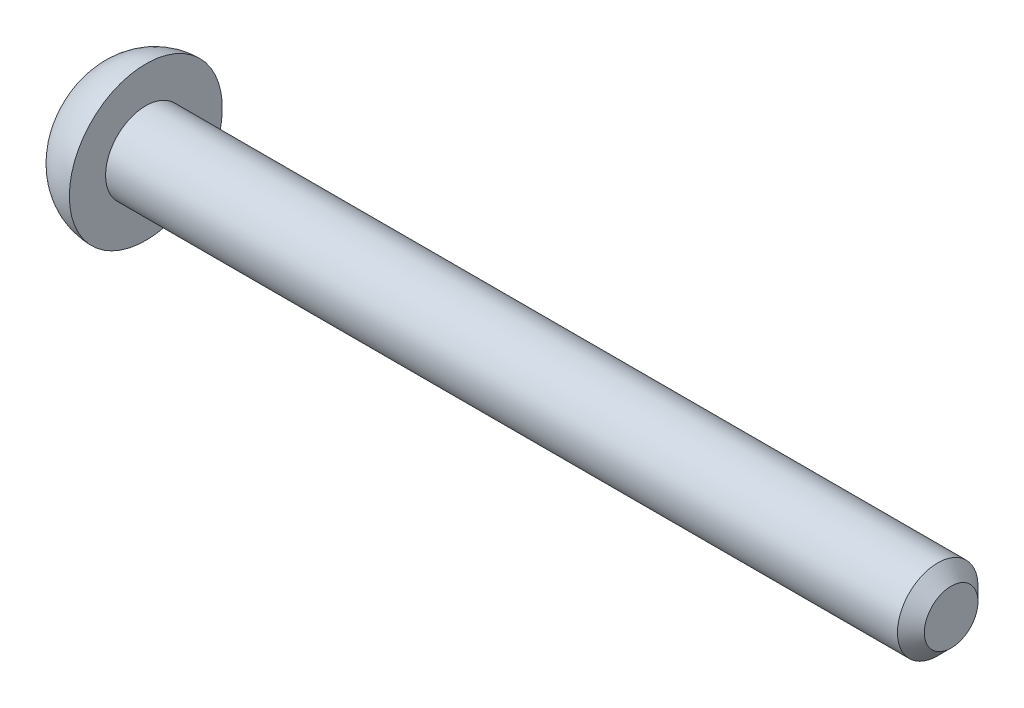
ISO-10303-21;
HEADER;
FILE_DESCRIPTION(('STEP AP214'),'2;1');
FILE_NAME('part.step','',(''),(''),'','','');
FILE_SCHEMA(('AUTOMOTIVE_DESIGN { 1 0 10303 214 1 1 1 1 }'));
ENDSEC;
DATA;
#1=APPLICATION_CONTEXT('core data for automotive mechanical design processes');
#2=APPLICATION_PROTOCOL_DEFINITION('international standard','automotive_design',2000,#1);
#3=PRODUCT_CONTEXT('',#1,'mechanical');
#4=PRODUCT('Part','Part','',(#3));
#5=PRODUCT_RELATED_PRODUCT_CATEGORY('part','',(#4));
#6=PRODUCT_DEFINITION_FORMATION('','',#4);
#7=PRODUCT_DEFINITION_CONTEXT('part definition',#1,'design');
#8=PRODUCT_DEFINITION('design','',#6,#7);
#9=PRODUCT_DEFINITION_SHAPE('','',#8);
#10=(LENGTH_UNIT() NAMED_UNIT(*) SI_UNIT(.MILLI.,.METRE.));
#11=(NAMED_UNIT(*) PLANE_ANGLE_UNIT() SI_UNIT($,.RADIAN.));
#12=(NAMED_UNIT(*) SI_UNIT($,.STERADIAN.) SOLID_ANGLE_UNIT());
#13=UNCERTAINTY_MEASURE_WITH_UNIT(LENGTH_MEASURE(1.E-05),#10,'distance_accuracy_value','');
#14=(GEOMETRIC_REPRESENTATION_CONTEXT(3) GLOBAL_UNCERTAINTY_ASSIGNED_CONTEXT((#13)) GLOBAL_UNIT_ASSIGNED_CONTEXT((#10,
#11,#12)) REPRESENTATION_CONTEXT('',''));
#15=CARTESIAN_POINT('',(0.,0.,0.));
#16=DIRECTION('',(0.,0.,1.));
#17=DIRECTION('',(1.,0.,0.));
#18=AXIS2_PLACEMENT_3D('',#15,#16,#17);
#19=CARTESIAN_POINT('',(-31.65,0.,-2.04903810567666));
#20=DIRECTION('',(1.,0.,0.));
#21=DIRECTION('',(0.,0.,-1.));
#22=AXIS2_PLACEMENT_3D('',#19,#20,#21);
#23=PLANE('',#22);
#24=CARTESIAN_POINT('',(-31.65,0.,0.));
#25=DIRECTION('',(-1.,0.,0.));
#26=DIRECTION('',(0.,0.,1.));
#27=AXIS2_PLACEMENT_3D('',#24,#25,#26);
#28=CIRCLE('',#27,2.04903810567666);
#29=CARTESIAN_POINT('',(-31.65,0.,2.04903810567666));
#30=VERTEX_POINT('',#29);
#31=EDGE_CURVE('E214',#30,#30,#28,.T.);
#32=ORIENTED_EDGE('',*,*,#31,.T.);
#33=EDGE_LOOP('',(#32));
#34=FACE_BOUND('',#33,.T.);
#35=CARTESIAN_POINT('',(-31.65,2.04903810567666,0.));
#36=DIRECTION('',(1.,0.,0.));
#37=DIRECTION('',(0.,0.,1.));
#38=AXIS2_PLACEMENT_3D('',#35,#36,#37);
#39=CIRCLE('',#38,1.02907378905691);
#40=CARTESIAN_POINT('',(-31.65,1.20759961003623,0.592430689092257));
#41=VERTEX_POINT('',#40);
#42=CARTESIAN_POINT('',(-31.65,1.20759961003623,-0.592430689092258));
#43=VERTEX_POINT('',#42);
#44=EDGE_CURVE('E160',#41,#43,#39,.T.);
#45=ORIENTED_EDGE('',*,*,#44,.F.);
#46=CARTESIAN_POINT('',(-31.65,1.12583302491977,0.650000000000001));
#47=DIRECTION('',(-1.,0.,0.));
#48=DIRECTION('',(0.,0.,1.));
#49=AXIS2_PLACEMENT_3D('',#46,#47,#48);
#50=CIRCLE('',#49,0.1);
#51=CARTESIAN_POINT('',(-31.65,1.11685983175353,0.74959659534543));
#52=VERTEX_POINT('',#51);
#53=EDGE_CURVE('E50',#52,#41,#50,.T.);
#54=ORIENTED_EDGE('',*,*,#53,.F.);
#55=CARTESIAN_POINT('',(-31.65,1.02451905283833,1.77451905283833));
#56=DIRECTION('',(1.,0.,0.));
#57=DIRECTION('',(0.,0.,1.));
#58=AXIS2_PLACEMENT_3D('',#55,#56,#57);
#59=CIRCLE('',#58,1.02907378905691);
#60=CARTESIAN_POINT('',(-31.65,0.0907397782827011,1.34202728443769));
#61=VERTEX_POINT('',#60);
#62=EDGE_CURVE('E187',#61,#52,#59,.T.);
#63=ORIENTED_EDGE('',*,*,#62,.F.);
#64=CARTESIAN_POINT('',(-31.65,0.,1.3));
#65=DIRECTION('',(-1.,0.,0.));
#66=DIRECTION('',(0.,0.,1.));
#67=AXIS2_PLACEMENT_3D('',#64,#65,#66);
#68=CIRCLE('',#67,0.1);
#69=CARTESIAN_POINT('',(-31.65,-0.0907397782827009,1.34202728443769));
#70=VERTEX_POINT('',#69);
#71=EDGE_CURVE('E185',#70,#61,#68,.T.);
#72=ORIENTED_EDGE('',*,*,#71,.F.);
#73=CARTESIAN_POINT('',(-31.65,-1.02451905283833,1.77451905283833));
#74=DIRECTION('',(1.,0.,0.));
#75=DIRECTION('',(0.,0.,1.));
#76=AXIS2_PLACEMENT_3D('',#73,#74,#75);
#77=CIRCLE('',#76,1.02907378905691);
#78=CARTESIAN_POINT('',(-31.65,-1.11685983175353,0.74959659534543));
#79=VERTEX_POINT('',#78);
#80=EDGE_CURVE('E134',#79,#70,#77,.T.);
#81=ORIENTED_EDGE('',*,*,#80,.F.);
#82=CARTESIAN_POINT('',(-31.65,-1.12583302491977,0.650000000000001));
#83=DIRECTION('',(-1.,0.,0.));
#84=DIRECTION('',(0.,0.,-1.));
#85=AXIS2_PLACEMENT_3D('',#82,#83,#84);
#86=CIRCLE('',#85,0.0999999999999997);
#87=CARTESIAN_POINT('',(-31.65,-1.20759961003623,0.592430689092258));
#88=VERTEX_POINT('',#87);
#89=EDGE_CURVE('E181',#88,#79,#86,.T.);
#90=ORIENTED_EDGE('',*,*,#89,.F.);
#91=CARTESIAN_POINT('',(-31.65,-2.04903810567666,0.));
#92=DIRECTION('',(1.,0.,0.));
#93=DIRECTION('',(0.,0.,-1.));
#94=AXIS2_PLACEMENT_3D('',#91,#92,#93);
#95=CIRCLE('',#94,1.02907378905691);
#96=CARTESIAN_POINT('',(-31.65,-1.20759961003623,-0.592430689092258));
#97=VERTEX_POINT('',#96);
#98=EDGE_CURVE('E178',#97,#88,#95,.T.);
#99=ORIENTED_EDGE('',*,*,#98,.F.);
#100=CARTESIAN_POINT('',(-31.65,-1.12583302491977,-0.650000000000001));
#101=DIRECTION('',(-1.,0.,0.));
#102=DIRECTION('',(0.,0.,1.));
#103=AXIS2_PLACEMENT_3D('',#100,#101,#102);
#104=CIRCLE('',#103,0.0999999999999999);
#105=CARTESIAN_POINT('',(-31.65,-1.11685983175353,-0.749596595345431));
#106=VERTEX_POINT('',#105);
#107=EDGE_CURVE('E175',#106,#97,#104,.T.);
#108=ORIENTED_EDGE('',*,*,#107,.F.);
#109=CARTESIAN_POINT('',(-31.65,-1.02451905283833,-1.77451905283833));
#110=DIRECTION('',(1.,0.,0.));
#111=DIRECTION('',(0.,0.,1.));
#112=AXIS2_PLACEMENT_3D('',#109,#110,#111);
#113=CIRCLE('',#112,1.02907378905691);
#114=CARTESIAN_POINT('',(-31.65,-0.0907397782827007,-1.34202728443769));
#115=VERTEX_POINT('',#114);
#116=EDGE_CURVE('E172',#115,#106,#113,.T.);
#117=ORIENTED_EDGE('',*,*,#116,.F.);
#118=CARTESIAN_POINT('',(-31.65,0.,-1.3));
#119=DIRECTION('',(-1.,0.,0.));
#120=DIRECTION('',(0.,0.,1.));
#121=AXIS2_PLACEMENT_3D('',#118,#119,#120);
#122=CIRCLE('',#121,0.1);
#123=CARTESIAN_POINT('',(-31.65,0.0907397782827007,-1.34202728443769));
#124=VERTEX_POINT('',#123);
#125=EDGE_CURVE('E169',#124,#115,#122,.T.);
#126=ORIENTED_EDGE('',*,*,#125,.F.);
#127=CARTESIAN_POINT('',(-31.65,1.02451905283833,-1.77451905283833));
#128=DIRECTION('',(1.,0.,0.));
#129=DIRECTION('',(0.,0.,1.));
#130=AXIS2_PLACEMENT_3D('',#127,#128,#129);
#131=CIRCLE('',#130,1.02907378905691);
#132=CARTESIAN_POINT('',(-31.65,1.11685983175353,-0.74959659534543));
#133=VERTEX_POINT('',#132);
#134=EDGE_CURVE('E166',#133,#124,#131,.T.);
#135=ORIENTED_EDGE('',*,*,#134,.F.);
#136=CARTESIAN_POINT('',(-31.65,1.12583302491977,-0.650000000000001));
#137=DIRECTION('',(-1.,0.,0.));
#138=DIRECTION('',(0.,0.,-1.));
#139=AXIS2_PLACEMENT_3D('',#136,#137,#138);
#140=CIRCLE('',#139,0.0999999999999998);
#141=EDGE_CURVE('E163',#43,#133,#140,.T.);
#142=ORIENTED_EDGE('',*,*,#141,.F.);
#143=EDGE_LOOP('',(#45,#54,#63,#72,#81,#90,#99,#108,#117,#126,#135,#142));
#144=FACE_BOUND('',#143,.T.);
#145=ADVANCED_FACE('F35',(#34,#144),#23,.F.);
#146=CARTESIAN_POINT('',(-30.,0.,0.));
#147=DIRECTION('',(-1.,0.,0.));
#148=DIRECTION('',(0.,0.,1.));
#149=AXIS2_PLACEMENT_3D('',#146,#147,#148);
#150=DEGENERATE_TOROIDAL_SURFACE('',#149,0.749999999999998,2.1,.T.);
#151=ORIENTED_EDGE('',*,*,#31,.F.);
#152=EDGE_LOOP('',(#151));
#153=FACE_BOUND('',#152,.T.);
#154=CARTESIAN_POINT('',(-30.,0.,0.));
#155=DIRECTION('',(-1.,0.,0.));
#156=DIRECTION('',(0.,0.,1.));
#157=AXIS2_PLACEMENT_3D('',#154,#155,#156);
#158=CIRCLE('',#157,2.85);
#159=CARTESIAN_POINT('',(-30.,0.,2.85));
#160=VERTEX_POINT('',#159);
#161=EDGE_CURVE('E211',#160,#160,#158,.T.);
#162=ORIENTED_EDGE('',*,*,#161,.T.);
#163=EDGE_LOOP('',(#162));
#164=FACE_BOUND('',#163,.T.);
#165=ADVANCED_FACE('F236',(#153,#164),#150,.T.);
#166=CARTESIAN_POINT('',(-30.,0.,-2.85));
#167=DIRECTION('',(-1.,0.,0.));
#168=DIRECTION('',(0.,0.,1.));
#169=AXIS2_PLACEMENT_3D('',#166,#167,#168);
#170=PLANE('',#169);
#171=ORIENTED_EDGE('',*,*,#161,.F.);
#172=EDGE_LOOP('',(#171));
#173=FACE_BOUND('',#172,.T.);
#174=CARTESIAN_POINT('',(-30.,0.,0.));
#175=DIRECTION('',(-1.,0.,0.));
#176=DIRECTION('',(0.,0.,1.));
#177=AXIS2_PLACEMENT_3D('',#174,#175,#176);
#178=CIRCLE('',#177,1.5);
#179=CARTESIAN_POINT('',(-30.,0.,1.5));
#180=VERTEX_POINT('',#179);
#181=EDGE_CURVE('E191',#180,#180,#178,.T.);
#182=ORIENTED_EDGE('',*,*,#181,.T.);
#183=EDGE_LOOP('',(#182));
#184=FACE_BOUND('',#183,.T.);
#185=ADVANCED_FACE('F241',(#173,#184),#170,.F.);
#186=CARTESIAN_POINT('',(-31.65,0.,0.));
#187=DIRECTION('',(-1.,0.,0.));
#188=DIRECTION('',(0.,0.,1.));
#189=AXIS2_PLACEMENT_3D('',#186,#187,#188);
#190=CYLINDRICAL_SURFACE('',#189,1.5);
#191=CARTESIAN_POINT('',(-0.500000000000007,0.,0.));
#192=DIRECTION('',(-1.,0.,0.));
#193=DIRECTION('',(0.,0.,1.));
#194=AXIS2_PLACEMENT_3D('',#191,#192,#193);
#195=CIRCLE('',#194,1.5);
#196=CARTESIAN_POINT('',(-0.500000000000007,0.,1.5));
#197=VERTEX_POINT('',#196);
#198=EDGE_CURVE('E43',#197,#197,#195,.T.);
#199=ORIENTED_EDGE('',*,*,#198,.T.);
#200=EDGE_LOOP('',(#199));
#201=FACE_BOUND('',#200,.T.);
#202=ORIENTED_EDGE('',*,*,#181,.F.);
#203=EDGE_LOOP('',(#202));
#204=FACE_BOUND('',#203,.T.);
#205=ADVANCED_FACE('F219',(#201,#204),#190,.T.);
#206=CARTESIAN_POINT('',(0.,0.,0.));
#207=DIRECTION('',(-1.,0.,0.));
#208=DIRECTION('',(0.,0.,1.));
#209=AXIS2_PLACEMENT_3D('',#206,#207,#208);
#210=PLANE('',#209);
#211=CARTESIAN_POINT('',(0.,0.,0.));
#212=DIRECTION('',(-1.,0.,0.));
#213=DIRECTION('',(0.,0.,1.));
#214=AXIS2_PLACEMENT_3D('',#211,#212,#213);
#215=CIRCLE('',#214,0.99999999999999);
#216=CARTESIAN_POINT('',(0.,0.,0.99999999999999));
#217=VERTEX_POINT('',#216);
#218=EDGE_CURVE('E11',#217,#217,#215,.F.);
#219=ORIENTED_EDGE('',*,*,#218,.T.);
#220=EDGE_LOOP('',(#219));
#221=FACE_BOUND('',#220,.T.);
#222=ADVANCED_FACE('F224',(#221),#210,.F.);
#223=CARTESIAN_POINT('',(-0.500000000000007,0.,0.));
#224=DIRECTION('',(-1.,0.,0.));
#225=DIRECTION('',(0.,0.,1.));
#226=AXIS2_PLACEMENT_3D('',#223,#224,#225);
#227=CONICAL_SURFACE('',#226,1.5,0.785398163397449);
#228=ORIENTED_EDGE('',*,*,#218,.F.);
#229=EDGE_LOOP('',(#228));
#230=FACE_BOUND('',#229,.T.);
#231=ORIENTED_EDGE('',*,*,#198,.F.);
#232=EDGE_LOOP('',(#231));
#233=FACE_BOUND('',#232,.T.);
#234=ADVANCED_FACE('F37',(#230,#233),#227,.T.);
#235=CARTESIAN_POINT('',(-30.65,1.12583302491977,0.650000000000001));
#236=DIRECTION('',(-1.,0.,0.));
#237=DIRECTION('',(0.,0.,1.));
#238=AXIS2_PLACEMENT_3D('',#235,#236,#237);
#239=CYLINDRICAL_SURFACE('',#238,0.1);
#240=ORIENTED_EDGE('',*,*,#53,.T.);
#241=DIRECTION('',(-1.,0.,0.));
#242=VECTOR('',#241,1.);
#243=CARTESIAN_POINT('',(-30.65,1.20759961003623,0.592430689092257));
#244=LINE('',#243,#242);
#245=CARTESIAN_POINT('',(-30.65,1.20759961003623,0.592430689092257));
#246=VERTEX_POINT('',#245);
#247=EDGE_CURVE('E98',#246,#41,#244,.T.);
#248=ORIENTED_EDGE('',*,*,#247,.F.);
#249=CARTESIAN_POINT('',(-30.65,1.12583302491977,0.650000000000001));
#250=DIRECTION('',(-1.,0.,0.));
#251=DIRECTION('',(0.,0.,1.));
#252=AXIS2_PLACEMENT_3D('',#249,#250,#251);
#253=CIRCLE('',#252,0.1);
#254=CARTESIAN_POINT('',(-30.65,1.11685983175353,0.74959659534543));
#255=VERTEX_POINT('',#254);
#256=EDGE_CURVE('E189',#255,#246,#253,.T.);
#257=ORIENTED_EDGE('',*,*,#256,.F.);
#258=DIRECTION('',(-1.,0.,0.));
#259=VECTOR('',#258,1.);
#260=CARTESIAN_POINT('',(-30.65,1.11685983175353,0.74959659534543));
#261=LINE('',#260,#259);
#262=EDGE_CURVE('E58',#255,#52,#261,.T.);
#263=ORIENTED_EDGE('',*,*,#262,.T.);
#264=EDGE_LOOP('',(#240,#248,#257,#263));
#265=FACE_BOUND('',#264,.T.);
#266=ADVANCED_FACE('F223',(#265),#239,.F.);
#267=CARTESIAN_POINT('',(-30.65,1.02451905283833,1.77451905283833));
#268=DIRECTION('',(-1.,0.,0.));
#269=DIRECTION('',(0.,0.,1.));
#270=AXIS2_PLACEMENT_3D('',#267,#268,#269);
#271=CYLINDRICAL_SURFACE('',#270,1.02907378905691);
#272=ORIENTED_EDGE('',*,*,#62,.T.);
#273=ORIENTED_EDGE('',*,*,#262,.F.);
#274=CARTESIAN_POINT('',(-30.65,1.02451905283833,1.77451905283833));
#275=DIRECTION('',(1.,0.,0.));
#276=DIRECTION('',(0.,0.,1.));
#277=AXIS2_PLACEMENT_3D('',#274,#275,#276);
#278=CIRCLE('',#277,1.02907378905691);
#279=CARTESIAN_POINT('',(-30.65,0.0907397782827011,1.34202728443769));
#280=VERTEX_POINT('',#279);
#281=EDGE_CURVE('E146',#280,#255,#278,.T.);
#282=ORIENTED_EDGE('',*,*,#281,.F.);
#283=DIRECTION('',(-1.,0.,0.));
#284=VECTOR('',#283,1.);
#285=CARTESIAN_POINT('',(-30.65,0.0907397782827011,1.34202728443769));
#286=LINE('',#285,#284);
#287=EDGE_CURVE('E138',#280,#61,#286,.T.);
#288=ORIENTED_EDGE('',*,*,#287,.T.);
#289=EDGE_LOOP('',(#272,#273,#282,#288));
#290=FACE_BOUND('',#289,.T.);
#291=ADVANCED_FACE('F230',(#290),#271,.T.);
#292=CARTESIAN_POINT('',(-30.65,0.,1.3));
#293=DIRECTION('',(-1.,0.,0.));
#294=DIRECTION('',(0.,0.,1.));
#295=AXIS2_PLACEMENT_3D('',#292,#293,#294);
#296=CYLINDRICAL_SURFACE('',#295,0.1);
#297=ORIENTED_EDGE('',*,*,#71,.T.);
#298=ORIENTED_EDGE('',*,*,#287,.F.);
#299=CARTESIAN_POINT('',(-30.65,0.,1.3));
#300=DIRECTION('',(-1.,0.,0.));
#301=DIRECTION('',(0.,0.,1.));
#302=AXIS2_PLACEMENT_3D('',#299,#300,#301);
#303=CIRCLE('',#302,0.1);
#304=CARTESIAN_POINT('',(-30.65,-0.0907397782827009,1.34202728443769));
#305=VERTEX_POINT('',#304);
#306=EDGE_CURVE('E142',#305,#280,#303,.T.);
#307=ORIENTED_EDGE('',*,*,#306,.F.);
#308=DIRECTION('',(-1.,0.,0.));
#309=VECTOR('',#308,1.);
#310=CARTESIAN_POINT('',(-30.65,-0.0907397782827009,1.34202728443769));
#311=LINE('',#310,#309);
#312=EDGE_CURVE('E127',#305,#70,#311,.T.);
#313=ORIENTED_EDGE('',*,*,#312,.T.);
#314=EDGE_LOOP('',(#297,#298,#307,#313));
#315=FACE_BOUND('',#314,.T.);
#316=ADVANCED_FACE('F143',(#315),#296,.F.);
#317=CARTESIAN_POINT('',(-30.65,-1.02451905283833,1.77451905283833));
#318=DIRECTION('',(-1.,0.,0.));
#319=DIRECTION('',(0.,0.,1.));
#320=AXIS2_PLACEMENT_3D('',#317,#318,#319);
#321=CYLINDRICAL_SURFACE('',#320,1.02907378905691);
#322=ORIENTED_EDGE('',*,*,#80,.T.);
#323=ORIENTED_EDGE('',*,*,#312,.F.);
#324=CARTESIAN_POINT('',(-30.65,-1.02451905283833,1.77451905283833));
#325=DIRECTION('',(1.,0.,0.));
#326=DIRECTION('',(0.,0.,1.));
#327=AXIS2_PLACEMENT_3D('',#324,#325,#326);
#328=CIRCLE('',#327,1.02907378905691);
#329=CARTESIAN_POINT('',(-30.65,-1.11685983175353,0.74959659534543));
#330=VERTEX_POINT('',#329);
#331=EDGE_CURVE('E131',#330,#305,#328,.T.);
#332=ORIENTED_EDGE('',*,*,#331,.F.);
#333=DIRECTION('',(-1.,0.,0.));
#334=VECTOR('',#333,1.);
#335=CARTESIAN_POINT('',(-30.65,-1.11685983175353,0.74959659534543));
#336=LINE('',#335,#334);
#337=EDGE_CURVE('E139',#330,#79,#336,.T.);
#338=ORIENTED_EDGE('',*,*,#337,.T.);
#339=EDGE_LOOP('',(#322,#323,#332,#338));
#340=FACE_BOUND('',#339,.T.);
#341=ADVANCED_FACE('F129',(#340),#321,.T.);
#342=CARTESIAN_POINT('',(-30.65,-1.12583302491977,0.650000000000001));
#343=DIRECTION('',(-1.,0.,0.));
#344=DIRECTION('',(0.,0.,1.));
#345=AXIS2_PLACEMENT_3D('',#342,#343,#344);
#346=CYLINDRICAL_SURFACE('',#345,0.0999999999999997);
#347=ORIENTED_EDGE('',*,*,#89,.T.);
#348=ORIENTED_EDGE('',*,*,#337,.F.);
#349=CARTESIAN_POINT('',(-30.65,-1.12583302491977,0.650000000000001));
#350=DIRECTION('',(-1.,0.,0.));
#351=DIRECTION('',(0.,0.,-1.));
#352=AXIS2_PLACEMENT_3D('',#349,#350,#351);
#353=CIRCLE('',#352,0.0999999999999997);
#354=CARTESIAN_POINT('',(-30.65,-1.20759961003623,0.592430689092258));
#355=VERTEX_POINT('',#354);
#356=EDGE_CURVE('E152',#355,#330,#353,.T.);
#357=ORIENTED_EDGE('',*,*,#356,.F.);
#358=DIRECTION('',(-1.,0.,0.));
#359=VECTOR('',#358,1.);
#360=CARTESIAN_POINT('',(-30.65,-1.20759961003623,0.592430689092258));
#361=LINE('',#360,#359);
#362=EDGE_CURVE('E194',#355,#88,#361,.T.);
#363=ORIENTED_EDGE('',*,*,#362,.T.);
#364=EDGE_LOOP('',(#347,#348,#357,#363));
#365=FACE_BOUND('',#364,.T.);
#366=ADVANCED_FACE('F278',(#365),#346,.F.);
#367=CARTESIAN_POINT('',(-30.65,-2.04903810567666,0.));
#368=DIRECTION('',(-1.,0.,0.));
#369=DIRECTION('',(0.,0.,1.));
#370=AXIS2_PLACEMENT_3D('',#367,#368,#369);
#371=CYLINDRICAL_SURFACE('',#370,1.02907378905691);
#372=ORIENTED_EDGE('',*,*,#98,.T.);
#373=ORIENTED_EDGE('',*,*,#362,.F.);
#374=CARTESIAN_POINT('',(-30.65,-2.04903810567666,0.));
#375=DIRECTION('',(1.,0.,0.));
#376=DIRECTION('',(0.,0.,-1.));
#377=AXIS2_PLACEMENT_3D('',#374,#375,#376);
#378=CIRCLE('',#377,1.02907378905691);
#379=CARTESIAN_POINT('',(-30.65,-1.20759961003623,-0.592430689092258));
#380=VERTEX_POINT('',#379);
#381=EDGE_CURVE('E154',#380,#355,#378,.T.);
#382=ORIENTED_EDGE('',*,*,#381,.F.);
#383=DIRECTION('',(-1.,0.,0.));
#384=VECTOR('',#383,1.);
#385=CARTESIAN_POINT('',(-30.65,-1.20759961003623,-0.592430689092258));
#386=LINE('',#385,#384);
#387=EDGE_CURVE('E196',#380,#97,#386,.T.);
#388=ORIENTED_EDGE('',*,*,#387,.T.);
#389=EDGE_LOOP('',(#372,#373,#382,#388));
#390=FACE_BOUND('',#389,.T.);
#391=ADVANCED_FACE('F274',(#390),#371,.T.);
#392=CARTESIAN_POINT('',(-30.65,-1.12583302491977,-0.650000000000001));
#393=DIRECTION('',(-1.,0.,0.));
#394=DIRECTION('',(0.,0.,1.));
#395=AXIS2_PLACEMENT_3D('',#392,#393,#394);
#396=CYLINDRICAL_SURFACE('',#395,0.0999999999999999);
#397=ORIENTED_EDGE('',*,*,#107,.T.);
#398=ORIENTED_EDGE('',*,*,#387,.F.);
#399=CARTESIAN_POINT('',(-30.65,-1.12583302491977,-0.650000000000001));
#400=DIRECTION('',(-1.,0.,0.));
#401=DIRECTION('',(0.,0.,1.));
#402=AXIS2_PLACEMENT_3D('',#399,#400,#401);
#403=CIRCLE('',#402,0.0999999999999999);
#404=CARTESIAN_POINT('',(-30.65,-1.11685983175353,-0.749596595345431));
#405=VERTEX_POINT('',#404);
#406=EDGE_CURVE('E422',#405,#380,#403,.T.);
#407=ORIENTED_EDGE('',*,*,#406,.F.);
#408=DIRECTION('',(-1.,0.,0.));
#409=VECTOR('',#408,1.);
#410=CARTESIAN_POINT('',(-30.65,-1.11685983175353,-0.749596595345431));
#411=LINE('',#410,#409);
#412=EDGE_CURVE('E198',#405,#106,#411,.T.);
#413=ORIENTED_EDGE('',*,*,#412,.T.);
#414=EDGE_LOOP('',(#397,#398,#407,#413));
#415=FACE_BOUND('',#414,.T.);
#416=ADVANCED_FACE('F270',(#415),#396,.F.);
#417=CARTESIAN_POINT('',(-30.65,-1.02451905283833,-1.77451905283833));
#418=DIRECTION('',(-1.,0.,0.));
#419=DIRECTION('',(0.,0.,1.));
#420=AXIS2_PLACEMENT_3D('',#417,#418,#419);
#421=CYLINDRICAL_SURFACE('',#420,1.02907378905691);
#422=ORIENTED_EDGE('',*,*,#116,.T.);
#423=ORIENTED_EDGE('',*,*,#412,.F.);
#424=CARTESIAN_POINT('',(-30.65,-1.02451905283833,-1.77451905283833));
#425=DIRECTION('',(1.,0.,0.));
#426=DIRECTION('',(0.,0.,1.));
#427=AXIS2_PLACEMENT_3D('',#424,#425,#426);
#428=CIRCLE('',#427,1.02907378905691);
#429=CARTESIAN_POINT('',(-30.65,-0.0907397782827007,-1.34202728443769));
#430=VERTEX_POINT('',#429);
#431=EDGE_CURVE('E419',#430,#405,#428,.T.);
#432=ORIENTED_EDGE('',*,*,#431,.F.);
#433=DIRECTION('',(-1.,0.,0.));
#434=VECTOR('',#433,1.);
#435=CARTESIAN_POINT('',(-30.65,-0.0907397782827007,-1.34202728443769));
#436=LINE('',#435,#434);
#437=EDGE_CURVE('E200',#430,#115,#436,.T.);
#438=ORIENTED_EDGE('',*,*,#437,.T.);
#439=EDGE_LOOP('',(#422,#423,#432,#438));
#440=FACE_BOUND('',#439,.T.);
#441=ADVANCED_FACE('F266',(#440),#421,.T.);
#442=CARTESIAN_POINT('',(-30.65,0.,-1.3));
#443=DIRECTION('',(-1.,0.,0.));
#444=DIRECTION('',(0.,0.,1.));
#445=AXIS2_PLACEMENT_3D('',#442,#443,#444);
#446=CYLINDRICAL_SURFACE('',#445,0.1);
#447=ORIENTED_EDGE('',*,*,#125,.T.);
#448=ORIENTED_EDGE('',*,*,#437,.F.);
#449=CARTESIAN_POINT('',(-30.65,0.,-1.3));
#450=DIRECTION('',(-1.,0.,0.));
#451=DIRECTION('',(0.,0.,1.));
#452=AXIS2_PLACEMENT_3D('',#449,#450,#451);
#453=CIRCLE('',#452,0.1);
#454=CARTESIAN_POINT('',(-30.65,0.0907397782827007,-1.34202728443769));
#455=VERTEX_POINT('',#454);
#456=EDGE_CURVE('E416',#455,#430,#453,.T.);
#457=ORIENTED_EDGE('',*,*,#456,.F.);
#458=DIRECTION('',(-1.,0.,0.));
#459=VECTOR('',#458,1.);
#460=CARTESIAN_POINT('',(-30.65,0.0907397782827007,-1.34202728443769));
#461=LINE('',#460,#459);
#462=EDGE_CURVE('E202',#455,#124,#461,.T.);
#463=ORIENTED_EDGE('',*,*,#462,.T.);
#464=EDGE_LOOP('',(#447,#448,#457,#463));
#465=FACE_BOUND('',#464,.T.);
#466=ADVANCED_FACE('F262',(#465),#446,.F.);
#467=CARTESIAN_POINT('',(-30.65,1.02451905283833,-1.77451905283833));
#468=DIRECTION('',(-1.,0.,0.));
#469=DIRECTION('',(0.,0.,1.));
#470=AXIS2_PLACEMENT_3D('',#467,#468,#469);
#471=CYLINDRICAL_SURFACE('',#470,1.02907378905691);
#472=ORIENTED_EDGE('',*,*,#134,.T.);
#473=ORIENTED_EDGE('',*,*,#462,.F.);
#474=CARTESIAN_POINT('',(-30.65,1.02451905283833,-1.77451905283833));
#475=DIRECTION('',(1.,0.,0.));
#476=DIRECTION('',(0.,0.,1.));
#477=AXIS2_PLACEMENT_3D('',#474,#475,#476);
#478=CIRCLE('',#477,1.02907378905691);
#479=CARTESIAN_POINT('',(-30.65,1.11685983175353,-0.74959659534543));
#480=VERTEX_POINT('',#479);
#481=EDGE_CURVE('E413',#480,#455,#478,.T.);
#482=ORIENTED_EDGE('',*,*,#481,.F.);
#483=DIRECTION('',(-1.,0.,0.));
#484=VECTOR('',#483,1.);
#485=CARTESIAN_POINT('',(-30.65,1.11685983175353,-0.74959659534543));
#486=LINE('',#485,#484);
#487=EDGE_CURVE('E204',#480,#133,#486,.T.);
#488=ORIENTED_EDGE('',*,*,#487,.T.);
#489=EDGE_LOOP('',(#472,#473,#482,#488));
#490=FACE_BOUND('',#489,.T.);
#491=ADVANCED_FACE('F258',(#490),#471,.T.);
#492=CARTESIAN_POINT('',(-30.65,1.12583302491977,-0.650000000000001));
#493=DIRECTION('',(-1.,0.,0.));
#494=DIRECTION('',(0.,0.,1.));
#495=AXIS2_PLACEMENT_3D('',#492,#493,#494);
#496=CYLINDRICAL_SURFACE('',#495,0.0999999999999998);
#497=ORIENTED_EDGE('',*,*,#141,.T.);
#498=ORIENTED_EDGE('',*,*,#487,.F.);
#499=CARTESIAN_POINT('',(-30.65,1.12583302491977,-0.650000000000001));
#500=DIRECTION('',(-1.,0.,0.));
#501=DIRECTION('',(0.,0.,-1.));
#502=AXIS2_PLACEMENT_3D('',#499,#500,#501);
#503=CIRCLE('',#502,0.0999999999999998);
#504=CARTESIAN_POINT('',(-30.65,1.20759961003623,-0.592430689092258));
#505=VERTEX_POINT('',#504);
#506=EDGE_CURVE('E408',#505,#480,#503,.T.);
#507=ORIENTED_EDGE('',*,*,#506,.F.);
#508=DIRECTION('',(-1.,0.,0.));
#509=VECTOR('',#508,1.);
#510=CARTESIAN_POINT('',(-30.65,1.20759961003623,-0.592430689092258));
#511=LINE('',#510,#509);
#512=EDGE_CURVE('E206',#505,#43,#511,.T.);
#513=ORIENTED_EDGE('',*,*,#512,.T.);
#514=EDGE_LOOP('',(#497,#498,#507,#513));
#515=FACE_BOUND('',#514,.T.);
#516=ADVANCED_FACE('F254',(#515),#496,.F.);
#517=CARTESIAN_POINT('',(-30.65,2.04903810567666,0.));
#518=DIRECTION('',(-1.,0.,0.));
#519=DIRECTION('',(0.,0.,1.));
#520=AXIS2_PLACEMENT_3D('',#517,#518,#519);
#521=CYLINDRICAL_SURFACE('',#520,1.02907378905691);
#522=ORIENTED_EDGE('',*,*,#44,.T.);
#523=ORIENTED_EDGE('',*,*,#512,.F.);
#524=CARTESIAN_POINT('',(-30.65,2.04903810567666,0.));
#525=DIRECTION('',(1.,0.,0.));
#526=DIRECTION('',(0.,0.,1.));
#527=AXIS2_PLACEMENT_3D('',#524,#525,#526);
#528=CIRCLE('',#527,1.02907378905691);
#529=EDGE_CURVE('E406',#246,#505,#528,.T.);
#530=ORIENTED_EDGE('',*,*,#529,.F.);
#531=ORIENTED_EDGE('',*,*,#247,.T.);
#532=EDGE_LOOP('',(#522,#523,#530,#531));
#533=FACE_BOUND('',#532,.T.);
#534=ADVANCED_FACE('F251',(#533),#521,.T.);
#535=CARTESIAN_POINT('',(-30.65,1.58743556529821,0.325));
#536=DIRECTION('',(-1.,0.,0.));
#537=DIRECTION('',(0.,0.,1.));
#538=AXIS2_PLACEMENT_3D('',#535,#536,#537);
#539=PLANE('',#538);
#540=ORIENTED_EDGE('',*,*,#256,.T.);
#541=ORIENTED_EDGE('',*,*,#529,.T.);
#542=ORIENTED_EDGE('',*,*,#506,.T.);
#543=ORIENTED_EDGE('',*,*,#481,.T.);
#544=ORIENTED_EDGE('',*,*,#456,.T.);
#545=ORIENTED_EDGE('',*,*,#431,.T.);
#546=ORIENTED_EDGE('',*,*,#406,.T.);
#547=ORIENTED_EDGE('',*,*,#381,.T.);
#548=ORIENTED_EDGE('',*,*,#356,.T.);
#549=ORIENTED_EDGE('',*,*,#331,.T.);
#550=ORIENTED_EDGE('',*,*,#306,.T.);
#551=ORIENTED_EDGE('',*,*,#281,.T.);
#552=EDGE_LOOP('',(#540,#541,#542,#543,#544,#545,#546,#547,#548,#549,#550,#551));
#553=FACE_BOUND('',#552,.T.);
#554=ADVANCED_FACE('F149',(#553),#539,.T.);
#555=CLOSED_SHELL('',(#145,#165,#185,#205,#222,#234,#266,#291,#316,#341,#366,#391,#416,#441,
#466,#491,#516,#534,#554));
#556=MANIFOLD_SOLID_BREP('B2',#555);
#557=ADVANCED_BREP_SHAPE_REPRESENTATION('',(#18,#556),#14);
#558=SHAPE_DEFINITION_REPRESENTATION(#9,#557);
ENDSEC;
END-ISO-10303-21;
